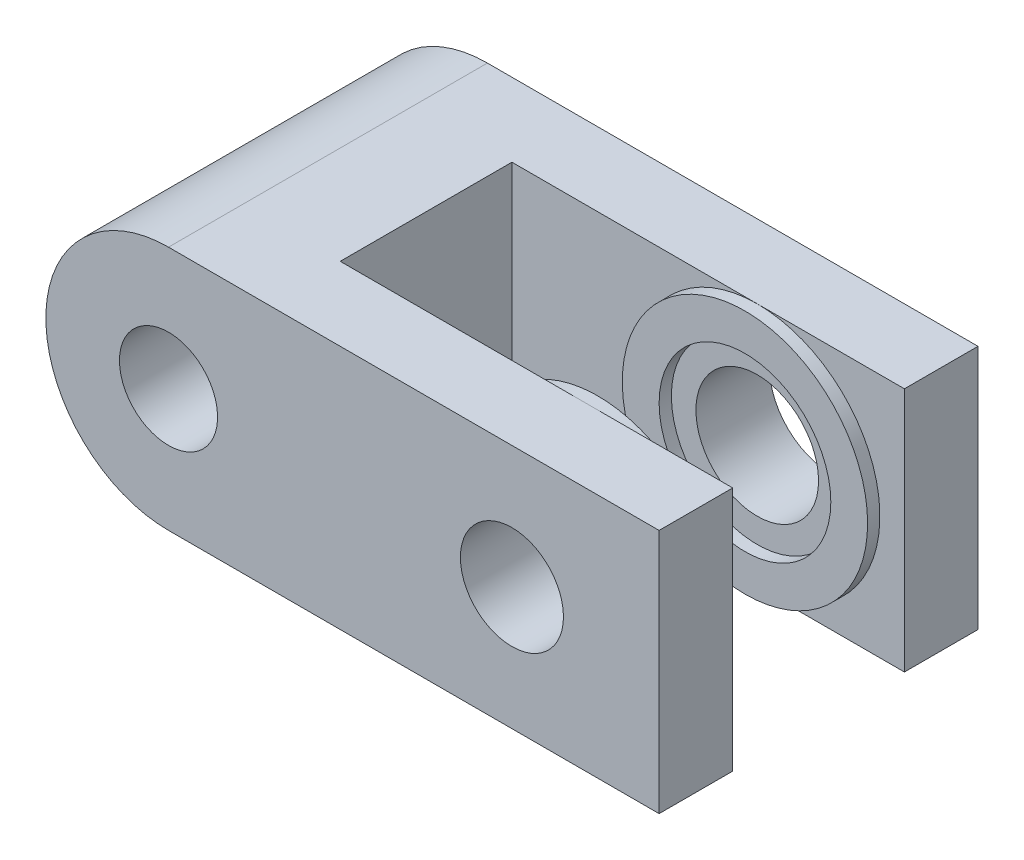
ISO-10303-21;
HEADER;
FILE_DESCRIPTION(('STEP AP214'),'2;1');
FILE_NAME('part.step','',(''),(''),'','','');
FILE_SCHEMA(('AUTOMOTIVE_DESIGN { 1 0 10303 214 1 1 1 1 }'));
ENDSEC;
DATA;
#1=APPLICATION_CONTEXT('core data for automotive mechanical design processes');
#2=APPLICATION_PROTOCOL_DEFINITION('international standard','automotive_design',2000,#1);
#3=PRODUCT_CONTEXT('',#1,'mechanical');
#4=PRODUCT('Part','Part','',(#3));
#5=PRODUCT_RELATED_PRODUCT_CATEGORY('part','',(#4));
#6=PRODUCT_DEFINITION_FORMATION('','',#4);
#7=PRODUCT_DEFINITION_CONTEXT('part definition',#1,'design');
#8=PRODUCT_DEFINITION('design','',#6,#7);
#9=PRODUCT_DEFINITION_SHAPE('','',#8);
#10=(LENGTH_UNIT() NAMED_UNIT(*) SI_UNIT(.MILLI.,.METRE.));
#11=(NAMED_UNIT(*) PLANE_ANGLE_UNIT() SI_UNIT($,.RADIAN.));
#12=(NAMED_UNIT(*) SI_UNIT($,.STERADIAN.) SOLID_ANGLE_UNIT());
#13=UNCERTAINTY_MEASURE_WITH_UNIT(LENGTH_MEASURE(1.E-05),#10,'distance_accuracy_value','');
#14=(GEOMETRIC_REPRESENTATION_CONTEXT(3) GLOBAL_UNCERTAINTY_ASSIGNED_CONTEXT((#13)) GLOBAL_UNIT_ASSIGNED_CONTEXT((#10,
#11,#12)) REPRESENTATION_CONTEXT('',''));
#15=CARTESIAN_POINT('',(0.,0.,0.));
#16=DIRECTION('',(0.,0.,1.));
#17=DIRECTION('',(1.,0.,0.));
#18=AXIS2_PLACEMENT_3D('',#15,#16,#17);
#19=CARTESIAN_POINT('',(20.,-5.,10.));
#20=DIRECTION('',(0.,0.,1.));
#21=DIRECTION('',(1.,0.,0.));
#22=AXIS2_PLACEMENT_3D('',#19,#20,#21);
#23=PLANE('',#22);
#24=CARTESIAN_POINT('',(14.,0.,10.));
#25=DIRECTION('',(0.,0.,-1.));
#26=DIRECTION('',(-1.,0.,0.));
#27=AXIS2_PLACEMENT_3D('',#24,#25,#26);
#28=CIRCLE('',#27,5.);
#29=CARTESIAN_POINT('',(14.,-5.,10.));
#30=VERTEX_POINT('',#29);
#31=CARTESIAN_POINT('',(14.,5.,10.));
#32=VERTEX_POINT('',#31);
#33=EDGE_CURVE('E137',#30,#32,#28,.T.);
#34=ORIENTED_EDGE('',*,*,#33,.F.);
#35=DIRECTION('',(1.,0.,0.));
#36=VECTOR('',#35,1.);
#37=CARTESIAN_POINT('',(20.,-5.,10.));
#38=LINE('',#37,#36);
#39=CARTESIAN_POINT('',(4.,-5.,10.));
#40=VERTEX_POINT('',#39);
#41=EDGE_CURVE('E120',#40,#30,#38,.T.);
#42=ORIENTED_EDGE('',*,*,#41,.F.);
#43=DIRECTION('',(0.,1.,0.));
#44=VECTOR('',#43,1.);
#45=CARTESIAN_POINT('',(4.,-5.,10.));
#46=LINE('',#45,#44);
#47=CARTESIAN_POINT('',(4.,5.,10.));
#48=VERTEX_POINT('',#47);
#49=EDGE_CURVE('E192',#40,#48,#46,.T.);
#50=ORIENTED_EDGE('',*,*,#49,.T.);
#51=DIRECTION('',(1.,0.,0.));
#52=VECTOR('',#51,1.);
#53=CARTESIAN_POINT('',(20.,5.,10.));
#54=LINE('',#53,#52);
#55=EDGE_CURVE('E139',#48,#32,#54,.T.);
#56=ORIENTED_EDGE('',*,*,#55,.T.);
#57=EDGE_LOOP('',(#34,#42,#50,#56));
#58=FACE_BOUND('',#57,.T.);
#59=ADVANCED_FACE('F41',(#58),#23,.F.);
#60=EDGE_CURVE('E56',#32,#30,#28,.T.);
#61=ORIENTED_EDGE('',*,*,#60,.F.);
#62=CARTESIAN_POINT('',(20.,5.,10.));
#63=VERTEX_POINT('',#62);
#64=EDGE_CURVE('E188',#32,#63,#54,.T.);
#65=ORIENTED_EDGE('',*,*,#64,.T.);
#66=DIRECTION('',(0.,1.,0.));
#67=VECTOR('',#66,1.);
#68=CARTESIAN_POINT('',(20.,-5.,10.));
#69=LINE('',#68,#67);
#70=CARTESIAN_POINT('',(20.,-5.,10.));
#71=VERTEX_POINT('',#70);
#72=EDGE_CURVE('E133',#71,#63,#69,.T.);
#73=ORIENTED_EDGE('',*,*,#72,.F.);
#74=EDGE_CURVE('E123',#30,#71,#38,.T.);
#75=ORIENTED_EDGE('',*,*,#74,.F.);
#76=EDGE_LOOP('',(#61,#65,#73,#75));
#77=FACE_BOUND('',#76,.T.);
#78=ADVANCED_FACE('F131',(#77),#23,.F.);
#79=CARTESIAN_POINT('',(20.,-5.,3.));
#80=DIRECTION('',(0.,0.,-1.));
#81=DIRECTION('',(-1.,0.,0.));
#82=AXIS2_PLACEMENT_3D('',#79,#80,#81);
#83=PLANE('',#82);
#84=CARTESIAN_POINT('',(14.,0.,3.));
#85=DIRECTION('',(0.,0.,-1.));
#86=DIRECTION('',(-1.,0.,0.));
#87=AXIS2_PLACEMENT_3D('',#84,#85,#86);
#88=CIRCLE('',#87,5.);
#89=CARTESIAN_POINT('',(14.,-5.,3.));
#90=VERTEX_POINT('',#89);
#91=CARTESIAN_POINT('',(14.,5.,3.));
#92=VERTEX_POINT('',#91);
#93=EDGE_CURVE('E11',#90,#92,#88,.F.);
#94=ORIENTED_EDGE('',*,*,#93,.F.);
#95=DIRECTION('',(-1.,0.,0.));
#96=VECTOR('',#95,1.);
#97=CARTESIAN_POINT('',(20.,-5.,3.));
#98=LINE('',#97,#96);
#99=CARTESIAN_POINT('',(20.,-5.,3.));
#100=VERTEX_POINT('',#99);
#101=EDGE_CURVE('E178',#100,#90,#98,.T.);
#102=ORIENTED_EDGE('',*,*,#101,.F.);
#103=DIRECTION('',(0.,1.,0.));
#104=VECTOR('',#103,1.);
#105=CARTESIAN_POINT('',(20.,-5.,3.));
#106=LINE('',#105,#104);
#107=CARTESIAN_POINT('',(20.,5.,3.00000000000001));
#108=VERTEX_POINT('',#107);
#109=EDGE_CURVE('E129',#100,#108,#106,.T.);
#110=ORIENTED_EDGE('',*,*,#109,.T.);
#111=DIRECTION('',(-1.,0.,0.));
#112=VECTOR('',#111,1.);
#113=CARTESIAN_POINT('',(20.,5.,3.));
#114=LINE('',#113,#112);
#115=EDGE_CURVE('E182',#108,#92,#114,.T.);
#116=ORIENTED_EDGE('',*,*,#115,.T.);
#117=EDGE_LOOP('',(#94,#102,#110,#116));
#118=FACE_BOUND('',#117,.T.);
#119=ADVANCED_FACE('F252',(#118),#83,.F.);
#120=CARTESIAN_POINT('',(14.,0.,3.));
#121=DIRECTION('',(0.,0.,1.));
#122=DIRECTION('',(1.,0.,0.));
#123=AXIS2_PLACEMENT_3D('',#120,#121,#122);
#124=CIRCLE('',#123,2.5);
#125=CARTESIAN_POINT('',(16.5,0.,3.));
#126=VERTEX_POINT('',#125);
#127=EDGE_CURVE('E169',#126,#126,#124,.T.);
#128=ORIENTED_EDGE('',*,*,#127,.F.);
#129=EDGE_LOOP('',(#128));
#130=FACE_BOUND('',#129,.T.);
#131=CARTESIAN_POINT('',(14.,0.,3.));
#132=DIRECTION('',(0.,0.,1.));
#133=DIRECTION('',(1.,0.,0.));
#134=AXIS2_PLACEMENT_3D('',#131,#132,#133);
#135=CIRCLE('',#134,3.5);
#136=CARTESIAN_POINT('',(17.5,0.,3.));
#137=VERTEX_POINT('',#136);
#138=EDGE_CURVE('E146',#137,#137,#135,.T.);
#139=ORIENTED_EDGE('',*,*,#138,.T.);
#140=EDGE_LOOP('',(#139));
#141=FACE_BOUND('',#140,.T.);
#142=ADVANCED_FACE('F287',(#130,#141),#83,.F.);
#143=CARTESIAN_POINT('',(0.,0.,13.));
#144=DIRECTION('',(0.,0.,-1.));
#145=DIRECTION('',(-1.,0.,0.));
#146=AXIS2_PLACEMENT_3D('',#143,#144,#145);
#147=CYLINDRICAL_SURFACE('',#146,2.);
#148=CARTESIAN_POINT('',(0.,0.,13.));
#149=DIRECTION('',(0.,0.,1.));
#150=DIRECTION('',(1.,0.,0.));
#151=AXIS2_PLACEMENT_3D('',#148,#149,#150);
#152=CIRCLE('',#151,2.);
#153=CARTESIAN_POINT('',(-2.,0.,13.));
#154=VERTEX_POINT('',#153);
#155=EDGE_CURVE('E210',#154,#154,#152,.T.);
#156=CARTESIAN_POINT('',(0.,0.,4.));
#157=DIRECTION('',(0.,0.,-1.));
#158=DIRECTION('',(-1.,0.,0.));
#159=AXIS2_PLACEMENT_3D('',#156,#157,#158);
#160=CIRCLE('',#159,2.);
#161=CARTESIAN_POINT('',(-2.,0.,4.));
#162=VERTEX_POINT('',#161);
#163=EDGE_CURVE('E162',#162,#162,#160,.T.);
#164=CARTESIAN_POINT('',(-2.,0.,13.));
#165=CARTESIAN_POINT('',(-2.,0.,12.90625));
#166=CARTESIAN_POINT('',(-2.,0.,12.8125));
#167=CARTESIAN_POINT('',(-2.,0.,12.625));
#168=CARTESIAN_POINT('',(-2.,0.,12.53125));
#169=CARTESIAN_POINT('',(-2.,0.,12.34375));
#170=CARTESIAN_POINT('',(-2.,0.,12.25));
#171=CARTESIAN_POINT('',(-2.,0.,12.0625));
#172=CARTESIAN_POINT('',(-2.,0.,11.96875));
#173=CARTESIAN_POINT('',(-2.,0.,11.78125));
#174=CARTESIAN_POINT('',(-2.,0.,11.6875));
#175=CARTESIAN_POINT('',(-2.,0.,11.5));
#176=CARTESIAN_POINT('',(-2.,0.,11.40625));
#177=CARTESIAN_POINT('',(-2.,0.,11.21875));
#178=CARTESIAN_POINT('',(-2.,0.,11.125));
#179=CARTESIAN_POINT('',(-2.,0.,10.9375));
#180=CARTESIAN_POINT('',(-2.,0.,10.84375));
#181=CARTESIAN_POINT('',(-2.,0.,10.65625));
#182=CARTESIAN_POINT('',(-2.,0.,10.5625));
#183=CARTESIAN_POINT('',(-2.,0.,10.375));
#184=CARTESIAN_POINT('',(-2.,0.,10.28125));
#185=CARTESIAN_POINT('',(-2.,0.,10.09375));
#186=CARTESIAN_POINT('',(-2.,0.,10.));
#187=CARTESIAN_POINT('',(-2.,0.,9.8125));
#188=CARTESIAN_POINT('',(-2.,0.,9.71875));
#189=CARTESIAN_POINT('',(-2.,0.,9.53125));
#190=CARTESIAN_POINT('',(-2.,0.,9.4375));
#191=CARTESIAN_POINT('',(-2.,0.,9.25));
#192=CARTESIAN_POINT('',(-2.,0.,9.15625));
#193=CARTESIAN_POINT('',(-2.,0.,8.96875));
#194=CARTESIAN_POINT('',(-2.,0.,8.875));
#195=CARTESIAN_POINT('',(-2.,0.,8.6875));
#196=CARTESIAN_POINT('',(-2.,0.,8.59375));
#197=CARTESIAN_POINT('',(-2.,0.,8.40625));
#198=CARTESIAN_POINT('',(-2.,0.,8.3125));
#199=CARTESIAN_POINT('',(-2.,0.,8.125));
#200=CARTESIAN_POINT('',(-2.,0.,8.03125));
#201=CARTESIAN_POINT('',(-2.,0.,7.84375));
#202=CARTESIAN_POINT('',(-2.,0.,7.75));
#203=CARTESIAN_POINT('',(-2.,0.,7.5625));
#204=CARTESIAN_POINT('',(-2.,0.,7.46875));
#205=CARTESIAN_POINT('',(-2.,0.,7.28125));
#206=CARTESIAN_POINT('',(-2.,0.,7.1875));
#207=CARTESIAN_POINT('',(-2.,0.,7.));
#208=CARTESIAN_POINT('',(-2.,0.,6.90625));
#209=CARTESIAN_POINT('',(-2.,0.,6.71875));
#210=CARTESIAN_POINT('',(-2.,0.,6.625));
#211=CARTESIAN_POINT('',(-2.,0.,6.4375));
#212=CARTESIAN_POINT('',(-2.,0.,6.34375));
#213=CARTESIAN_POINT('',(-2.,0.,6.15625));
#214=CARTESIAN_POINT('',(-2.,0.,6.0625));
#215=CARTESIAN_POINT('',(-2.,0.,5.875));
#216=CARTESIAN_POINT('',(-2.,0.,5.78125));
#217=CARTESIAN_POINT('',(-2.,0.,5.59375));
#218=CARTESIAN_POINT('',(-2.,0.,5.5));
#219=CARTESIAN_POINT('',(-2.,0.,5.3125));
#220=CARTESIAN_POINT('',(-2.,0.,5.21875));
#221=CARTESIAN_POINT('',(-2.,0.,5.03125));
#222=CARTESIAN_POINT('',(-2.,0.,4.9375));
#223=CARTESIAN_POINT('',(-2.,0.,4.75));
#224=CARTESIAN_POINT('',(-2.,0.,4.65625));
#225=CARTESIAN_POINT('',(-2.,0.,4.46875));
#226=CARTESIAN_POINT('',(-2.,0.,4.375));
#227=CARTESIAN_POINT('',(-2.,0.,4.1875));
#228=CARTESIAN_POINT('',(-2.,0.,4.09375));
#229=CARTESIAN_POINT('',(-2.,0.,4.));
#230=B_SPLINE_CURVE_WITH_KNOTS('',3,(#164,#165,#166,#167,#168,#169,#170,#171,#172,#173,#174,
#175,#176,#177,#178,#179,#180,#181,#182,#183,#184,#185,#186,#187,#188,#189,#190,#191,#192,#193,
#194,#195,#196,#197,#198,#199,#200,#201,#202,#203,#204,#205,#206,#207,#208,#209,#210,#211,#212,
#213,#214,#215,#216,#217,#218,#219,#220,#221,#222,#223,#224,#225,#226,#227,#228,#229),
.UNSPECIFIED.,.F.,.F.,(4,2,2,2,2,2,2,2,2,2,2,2,2,2,2,2,2,2,2,2,2,2,2,2,2,2,2,2,2,2,2,2,4),(0.,
0.28125,0.5625,0.843750000000001,1.125,1.40625,1.6875,1.96875,2.25,2.53125,2.8125,3.09375,3.375,
3.65625,3.9375,4.21875,4.5,4.78125,5.0625,5.34375,5.625,5.90625,6.1875,6.46875,6.75,7.03125,
7.3125,7.59375,7.875,8.15625,8.4375,8.71875,9.),.UNSPECIFIED.);
#231=EDGE_CURVE('BSEAM295',#154,#162,#230,.T.);
#232=ORIENTED_EDGE('',*,*,#155,.T.);
#233=ORIENTED_EDGE('',*,*,#163,.T.);
#234=ORIENTED_EDGE('',*,*,#231,.T.);
#235=ORIENTED_EDGE('',*,*,#231,.F.);
#236=EDGE_LOOP('',(#232,#234,#233,#235));
#237=FACE_BOUND('',#236,.T.);
#238=ADVANCED_FACE('F295',(#237),#147,.F.);
#239=CARTESIAN_POINT('',(20.,0.,13.));
#240=DIRECTION('',(1.,0.,0.));
#241=DIRECTION('',(0.,1.,0.));
#242=AXIS2_PLACEMENT_3D('',#239,#240,#241);
#243=PLANE('',#242);
#244=ORIENTED_EDGE('',*,*,#72,.T.);
#245=DIRECTION('',(0.,0.,-1.));
#246=VECTOR('',#245,1.);
#247=CARTESIAN_POINT('',(20.,5.,13.));
#248=LINE('',#247,#246);
#249=CARTESIAN_POINT('',(20.,5.,13.));
#250=VERTEX_POINT('',#249);
#251=EDGE_CURVE('E226',#250,#63,#248,.T.);
#252=ORIENTED_EDGE('',*,*,#251,.F.);
#253=DIRECTION('',(0.,-1.,0.));
#254=VECTOR('',#253,1.);
#255=CARTESIAN_POINT('',(20.,0.,13.));
#256=LINE('',#255,#254);
#257=CARTESIAN_POINT('',(20.,-5.,13.));
#258=VERTEX_POINT('',#257);
#259=EDGE_CURVE('E204',#250,#258,#256,.T.);
#260=ORIENTED_EDGE('',*,*,#259,.T.);
#261=DIRECTION('',(0.,0.,-1.));
#262=VECTOR('',#261,1.);
#263=CARTESIAN_POINT('',(20.,-5.,13.));
#264=LINE('',#263,#262);
#265=EDGE_CURVE('E230',#258,#71,#264,.T.);
#266=ORIENTED_EDGE('',*,*,#265,.T.);
#267=EDGE_LOOP('',(#244,#252,#260,#266));
#268=FACE_BOUND('',#267,.T.);
#269=ADVANCED_FACE('F298',(#268),#243,.T.);
#270=CARTESIAN_POINT('',(0.,0.,13.));
#271=DIRECTION('',(0.,0.,-1.));
#272=DIRECTION('',(-1.,0.,0.));
#273=AXIS2_PLACEMENT_3D('',#270,#271,#272);
#274=CYLINDRICAL_SURFACE('',#273,5.);
#275=CARTESIAN_POINT('',(0.,0.,0.));
#276=DIRECTION('',(0.,0.,1.));
#277=DIRECTION('',(1.,0.,0.));
#278=AXIS2_PLACEMENT_3D('',#275,#276,#277);
#279=CIRCLE('',#278,5.);
#280=CARTESIAN_POINT('',(0.,5.,0.));
#281=VERTEX_POINT('',#280);
#282=CARTESIAN_POINT('',(0.,-5.,0.));
#283=VERTEX_POINT('',#282);
#284=EDGE_CURVE('E191',#281,#283,#279,.T.);
#285=ORIENTED_EDGE('',*,*,#284,.T.);
#286=DIRECTION('',(0.,0.,-1.));
#287=VECTOR('',#286,1.);
#288=CARTESIAN_POINT('',(0.,-5.,13.));
#289=LINE('',#288,#287);
#290=CARTESIAN_POINT('',(0.,-5.,13.));
#291=VERTEX_POINT('',#290);
#292=EDGE_CURVE('E49',#291,#283,#289,.T.);
#293=ORIENTED_EDGE('',*,*,#292,.F.);
#294=CARTESIAN_POINT('',(0.,0.,13.));
#295=DIRECTION('',(0.,0.,1.));
#296=DIRECTION('',(1.,0.,0.));
#297=AXIS2_PLACEMENT_3D('',#294,#295,#296);
#298=CIRCLE('',#297,5.);
#299=CARTESIAN_POINT('',(0.,5.,13.));
#300=VERTEX_POINT('',#299);
#301=EDGE_CURVE('E198',#300,#291,#298,.T.);
#302=ORIENTED_EDGE('',*,*,#301,.F.);
#303=DIRECTION('',(0.,0.,-1.));
#304=VECTOR('',#303,1.);
#305=CARTESIAN_POINT('',(0.,5.,13.));
#306=LINE('',#305,#304);
#307=EDGE_CURVE('E213',#300,#281,#306,.T.);
#308=ORIENTED_EDGE('',*,*,#307,.T.);
#309=EDGE_LOOP('',(#285,#293,#302,#308));
#310=FACE_BOUND('',#309,.T.);
#311=ADVANCED_FACE('F43',(#310),#274,.T.);
#312=CARTESIAN_POINT('',(0.,-5.,13.));
#313=DIRECTION('',(0.,1.,0.));
#314=DIRECTION('',(0.,0.,1.));
#315=AXIS2_PLACEMENT_3D('',#312,#313,#314);
#316=PLANE('',#315);
#317=DIRECTION('',(0.,0.,1.));
#318=VECTOR('',#317,1.);
#319=CARTESIAN_POINT('',(4.,-5.,3.));
#320=LINE('',#319,#318);
#321=CARTESIAN_POINT('',(4.,-5.,3.));
#322=VERTEX_POINT('',#321);
#323=EDGE_CURVE('E126',#322,#40,#320,.T.);
#324=ORIENTED_EDGE('',*,*,#323,.T.);
#325=ORIENTED_EDGE('',*,*,#41,.T.);
#326=ORIENTED_EDGE('',*,*,#74,.T.);
#327=ORIENTED_EDGE('',*,*,#265,.F.);
#328=DIRECTION('',(1.,0.,0.));
#329=VECTOR('',#328,1.);
#330=CARTESIAN_POINT('',(0.,-5.,13.));
#331=LINE('',#330,#329);
#332=EDGE_CURVE('E201',#291,#258,#331,.T.);
#333=ORIENTED_EDGE('',*,*,#332,.F.);
#334=ORIENTED_EDGE('',*,*,#292,.T.);
#335=DIRECTION('',(1.,0.,0.));
#336=VECTOR('',#335,1.);
#337=CARTESIAN_POINT('',(0.,-5.,0.));
#338=LINE('',#337,#336);
#339=CARTESIAN_POINT('',(20.,-5.,0.));
#340=VERTEX_POINT('',#339);
#341=EDGE_CURVE('E216',#283,#340,#338,.T.);
#342=ORIENTED_EDGE('',*,*,#341,.T.);
#343=EDGE_CURVE('E229',#100,#340,#264,.T.);
#344=ORIENTED_EDGE('',*,*,#343,.F.);
#345=ORIENTED_EDGE('',*,*,#101,.T.);
#346=EDGE_CURVE('E180',#90,#322,#98,.T.);
#347=ORIENTED_EDGE('',*,*,#346,.T.);
#348=EDGE_LOOP('',(#324,#325,#326,#327,#333,#334,#342,#344,#345,#347));
#349=FACE_BOUND('',#348,.T.);
#350=ADVANCED_FACE('F121',(#349),#316,.F.);
#351=ORIENTED_EDGE('',*,*,#109,.F.);
#352=ORIENTED_EDGE('',*,*,#343,.T.);
#353=DIRECTION('',(0.,-1.,0.));
#354=VECTOR('',#353,1.);
#355=CARTESIAN_POINT('',(20.,0.,0.));
#356=LINE('',#355,#354);
#357=CARTESIAN_POINT('',(20.,5.,0.));
#358=VERTEX_POINT('',#357);
#359=EDGE_CURVE('E219',#358,#340,#356,.T.);
#360=ORIENTED_EDGE('',*,*,#359,.F.);
#361=EDGE_CURVE('E225',#108,#358,#248,.T.);
#362=ORIENTED_EDGE('',*,*,#361,.F.);
#363=EDGE_LOOP('',(#351,#352,#360,#362));
#364=FACE_BOUND('',#363,.T.);
#365=ADVANCED_FACE('F247',(#364),#243,.T.);
#366=CARTESIAN_POINT('',(0.,5.,13.));
#367=DIRECTION('',(0.,1.,0.));
#368=DIRECTION('',(0.,0.,1.));
#369=AXIS2_PLACEMENT_3D('',#366,#367,#368);
#370=PLANE('',#369);
#371=ORIENTED_EDGE('',*,*,#55,.F.);
#372=DIRECTION('',(0.,0.,1.));
#373=VECTOR('',#372,1.);
#374=CARTESIAN_POINT('',(4.,5.,3.));
#375=LINE('',#374,#373);
#376=CARTESIAN_POINT('',(4.,5.,3.));
#377=VERTEX_POINT('',#376);
#378=EDGE_CURVE('E185',#377,#48,#375,.T.);
#379=ORIENTED_EDGE('',*,*,#378,.F.);
#380=EDGE_CURVE('E177',#92,#377,#114,.T.);
#381=ORIENTED_EDGE('',*,*,#380,.F.);
#382=ORIENTED_EDGE('',*,*,#115,.F.);
#383=ORIENTED_EDGE('',*,*,#361,.T.);
#384=DIRECTION('',(1.,0.,0.));
#385=VECTOR('',#384,1.);
#386=CARTESIAN_POINT('',(0.,5.,0.));
#387=LINE('',#386,#385);
#388=EDGE_CURVE('E202',#281,#358,#387,.T.);
#389=ORIENTED_EDGE('',*,*,#388,.F.);
#390=ORIENTED_EDGE('',*,*,#307,.F.);
#391=DIRECTION('',(1.,0.,0.));
#392=VECTOR('',#391,1.);
#393=CARTESIAN_POINT('',(0.,5.,13.));
#394=LINE('',#393,#392);
#395=EDGE_CURVE('E207',#300,#250,#394,.T.);
#396=ORIENTED_EDGE('',*,*,#395,.T.);
#397=ORIENTED_EDGE('',*,*,#251,.T.);
#398=ORIENTED_EDGE('',*,*,#64,.F.);
#399=EDGE_LOOP('',(#371,#379,#381,#382,#383,#389,#390,#396,#397,#398));
#400=FACE_BOUND('',#399,.T.);
#401=ADVANCED_FACE('F241',(#400),#370,.T.);
#402=CARTESIAN_POINT('',(0.,0.,13.));
#403=DIRECTION('',(0.,0.,1.));
#404=DIRECTION('',(1.,0.,0.));
#405=AXIS2_PLACEMENT_3D('',#402,#403,#404);
#406=PLANE('',#405);
#407=CARTESIAN_POINT('',(14.,0.,13.));
#408=DIRECTION('',(0.,0.,1.));
#409=DIRECTION('',(1.,0.,0.));
#410=AXIS2_PLACEMENT_3D('',#407,#408,#409);
#411=CIRCLE('',#410,2.1);
#412=CARTESIAN_POINT('',(16.1,0.,13.));
#413=VERTEX_POINT('',#412);
#414=EDGE_CURVE('E158',#413,#413,#411,.T.);
#415=ORIENTED_EDGE('',*,*,#414,.F.);
#416=EDGE_LOOP('',(#415));
#417=FACE_BOUND('',#416,.T.);
#418=ORIENTED_EDGE('',*,*,#301,.T.);
#419=ORIENTED_EDGE('',*,*,#332,.T.);
#420=ORIENTED_EDGE('',*,*,#259,.F.);
#421=ORIENTED_EDGE('',*,*,#395,.F.);
#422=EDGE_LOOP('',(#418,#419,#420,#421));
#423=FACE_BOUND('',#422,.T.);
#424=ORIENTED_EDGE('',*,*,#155,.F.);
#425=EDGE_LOOP('',(#424));
#426=FACE_BOUND('',#425,.T.);
#427=ADVANCED_FACE('F288',(#417,#423,#426),#406,.T.);
#428=CARTESIAN_POINT('',(0.,0.,0.));
#429=DIRECTION('',(0.,0.,1.));
#430=DIRECTION('',(1.,0.,0.));
#431=AXIS2_PLACEMENT_3D('',#428,#429,#430);
#432=PLANE('',#431);
#433=CARTESIAN_POINT('',(0.,0.,0.));
#434=DIRECTION('',(0.,0.,-1.));
#435=DIRECTION('',(-1.,0.,0.));
#436=AXIS2_PLACEMENT_3D('',#433,#434,#435);
#437=CIRCLE('',#436,3.5);
#438=CARTESIAN_POINT('',(-3.5,0.,0.));
#439=VERTEX_POINT('',#438);
#440=EDGE_CURVE('E165',#439,#439,#437,.T.);
#441=ORIENTED_EDGE('',*,*,#440,.F.);
#442=EDGE_LOOP('',(#441));
#443=FACE_BOUND('',#442,.T.);
#444=CARTESIAN_POINT('',(14.,0.,0.));
#445=DIRECTION('',(0.,0.,1.));
#446=DIRECTION('',(1.,0.,0.));
#447=AXIS2_PLACEMENT_3D('',#444,#445,#446);
#448=CIRCLE('',#447,2.5);
#449=CARTESIAN_POINT('',(16.5,0.,0.));
#450=VERTEX_POINT('',#449);
#451=EDGE_CURVE('E174',#450,#450,#448,.F.);
#452=ORIENTED_EDGE('',*,*,#451,.F.);
#453=EDGE_LOOP('',(#452));
#454=FACE_BOUND('',#453,.T.);
#455=ORIENTED_EDGE('',*,*,#284,.F.);
#456=ORIENTED_EDGE('',*,*,#388,.T.);
#457=ORIENTED_EDGE('',*,*,#359,.T.);
#458=ORIENTED_EDGE('',*,*,#341,.F.);
#459=EDGE_LOOP('',(#455,#456,#457,#458));
#460=FACE_BOUND('',#459,.T.);
#461=ADVANCED_FACE('F239',(#443,#454,#460),#432,.F.);
#462=CARTESIAN_POINT('',(4.,-5.,3.));
#463=DIRECTION('',(-1.,0.,0.));
#464=DIRECTION('',(0.,0.,1.));
#465=AXIS2_PLACEMENT_3D('',#462,#463,#464);
#466=PLANE('',#465);
#467=ORIENTED_EDGE('',*,*,#378,.T.);
#468=ORIENTED_EDGE('',*,*,#49,.F.);
#469=ORIENTED_EDGE('',*,*,#323,.F.);
#470=DIRECTION('',(0.,1.,0.));
#471=VECTOR('',#470,1.);
#472=CARTESIAN_POINT('',(4.,-5.,3.));
#473=LINE('',#472,#471);
#474=EDGE_CURVE('E194',#322,#377,#473,.T.);
#475=ORIENTED_EDGE('',*,*,#474,.T.);
#476=EDGE_LOOP('',(#467,#468,#469,#475));
#477=FACE_BOUND('',#476,.T.);
#478=ADVANCED_FACE('F281',(#477),#466,.F.);
#479=CARTESIAN_POINT('',(14.,0.,3.));
#480=DIRECTION('',(0.,0.,1.));
#481=DIRECTION('',(1.,0.,0.));
#482=AXIS2_PLACEMENT_3D('',#479,#480,#481);
#483=CIRCLE('',#482,5.);
#484=EDGE_CURVE('E64',#92,#90,#483,.T.);
#485=ORIENTED_EDGE('',*,*,#484,.F.);
#486=ORIENTED_EDGE('',*,*,#380,.T.);
#487=ORIENTED_EDGE('',*,*,#474,.F.);
#488=ORIENTED_EDGE('',*,*,#346,.F.);
#489=EDGE_LOOP('',(#485,#486,#487,#488));
#490=FACE_BOUND('',#489,.T.);
#491=ADVANCED_FACE('F251',(#490),#83,.F.);
#492=CARTESIAN_POINT('',(14.,0.,-7.07106781186549));
#493=DIRECTION('',(0.,0.,1.));
#494=DIRECTION('',(1.,0.,0.));
#495=AXIS2_PLACEMENT_3D('',#492,#493,#494);
#496=CYLINDRICAL_SURFACE('',#495,2.5);
#497=ORIENTED_EDGE('',*,*,#451,.T.);
#498=EDGE_LOOP('',(#497));
#499=FACE_BOUND('',#498,.T.);
#500=ORIENTED_EDGE('',*,*,#127,.T.);
#501=EDGE_LOOP('',(#500));
#502=FACE_BOUND('',#501,.T.);
#503=ADVANCED_FACE('F279',(#499,#502),#496,.F.);
#504=CARTESIAN_POINT('',(0.,0.,4.));
#505=DIRECTION('',(0.,0.,-1.));
#506=DIRECTION('',(-1.,0.,0.));
#507=AXIS2_PLACEMENT_3D('',#504,#505,#506);
#508=CYLINDRICAL_SURFACE('',#507,3.5);
#509=CARTESIAN_POINT('',(0.,0.,4.));
#510=DIRECTION('',(0.,0.,-1.));
#511=DIRECTION('',(-1.,0.,0.));
#512=AXIS2_PLACEMENT_3D('',#509,#510,#511);
#513=CIRCLE('',#512,3.5);
#514=CARTESIAN_POINT('',(-3.5,0.,4.));
#515=VERTEX_POINT('',#514);
#516=EDGE_CURVE('E166',#515,#515,#513,.T.);
#517=ORIENTED_EDGE('',*,*,#516,.F.);
#518=EDGE_LOOP('',(#517));
#519=FACE_BOUND('',#518,.T.);
#520=ORIENTED_EDGE('',*,*,#440,.T.);
#521=EDGE_LOOP('',(#520));
#522=FACE_BOUND('',#521,.T.);
#523=ADVANCED_FACE('F324',(#519,#522),#508,.F.);
#524=CARTESIAN_POINT('',(0.,0.,4.));
#525=DIRECTION('',(0.,0.,-1.));
#526=DIRECTION('',(-1.,0.,0.));
#527=AXIS2_PLACEMENT_3D('',#524,#525,#526);
#528=PLANE('',#527);
#529=ORIENTED_EDGE('',*,*,#163,.F.);
#530=EDGE_LOOP('',(#529));
#531=FACE_BOUND('',#530,.T.);
#532=ORIENTED_EDGE('',*,*,#516,.T.);
#533=EDGE_LOOP('',(#532));
#534=FACE_BOUND('',#533,.T.);
#535=ADVANCED_FACE('F321',(#531,#534),#528,.T.);
#536=CARTESIAN_POINT('',(14.,0.,14.));
#537=DIRECTION('',(0.,0.,-1.));
#538=DIRECTION('',(-1.,0.,0.));
#539=AXIS2_PLACEMENT_3D('',#536,#537,#538);
#540=CYLINDRICAL_SURFACE('',#539,2.1);
#541=ORIENTED_EDGE('',*,*,#414,.T.);
#542=EDGE_LOOP('',(#541));
#543=FACE_BOUND('',#542,.T.);
#544=CARTESIAN_POINT('',(14.,0.,9.5));
#545=DIRECTION('',(0.,0.,-1.));
#546=DIRECTION('',(-1.,0.,0.));
#547=AXIS2_PLACEMENT_3D('',#544,#545,#546);
#548=CIRCLE('',#547,2.1);
#549=CARTESIAN_POINT('',(11.9,0.,9.5));
#550=VERTEX_POINT('',#549);
#551=EDGE_CURVE('E141',#550,#550,#548,.T.);
#552=ORIENTED_EDGE('',*,*,#551,.T.);
#553=EDGE_LOOP('',(#552));
#554=FACE_BOUND('',#553,.T.);
#555=ADVANCED_FACE('F267',(#543,#554),#540,.F.);
#556=CARTESIAN_POINT('',(14.,0.,3.5));
#557=DIRECTION('',(0.,0.,1.));
#558=DIRECTION('',(1.,0.,0.));
#559=AXIS2_PLACEMENT_3D('',#556,#557,#558);
#560=PLANE('',#559);
#561=CARTESIAN_POINT('',(14.,0.,3.5));
#562=DIRECTION('',(0.,0.,1.));
#563=DIRECTION('',(1.,0.,0.));
#564=AXIS2_PLACEMENT_3D('',#561,#562,#563);
#565=CIRCLE('',#564,5.);
#566=CARTESIAN_POINT('',(19.,0.,3.5));
#567=VERTEX_POINT('',#566);
#568=EDGE_CURVE('E155',#567,#567,#565,.T.);
#569=ORIENTED_EDGE('',*,*,#568,.T.);
#570=EDGE_LOOP('',(#569));
#571=FACE_BOUND('',#570,.T.);
#572=CARTESIAN_POINT('',(14.,0.,3.5));
#573=DIRECTION('',(0.,0.,1.));
#574=DIRECTION('',(1.,0.,0.));
#575=AXIS2_PLACEMENT_3D('',#572,#573,#574);
#576=CIRCLE('',#575,3.5);
#577=CARTESIAN_POINT('',(17.5,0.,3.5));
#578=VERTEX_POINT('',#577);
#579=EDGE_CURVE('E150',#578,#578,#576,.T.);
#580=ORIENTED_EDGE('',*,*,#579,.F.);
#581=EDGE_LOOP('',(#580));
#582=FACE_BOUND('',#581,.T.);
#583=ADVANCED_FACE('F257',(#571,#582),#560,.T.);
#584=CARTESIAN_POINT('',(14.,0.,3.5));
#585=DIRECTION('',(0.,0.,-1.));
#586=DIRECTION('',(-1.,0.,0.));
#587=AXIS2_PLACEMENT_3D('',#584,#585,#586);
#588=CYLINDRICAL_SURFACE('',#587,5.);
#589=ORIENTED_EDGE('',*,*,#568,.F.);
#590=EDGE_LOOP('',(#589));
#591=FACE_BOUND('',#590,.T.);
#592=ORIENTED_EDGE('',*,*,#484,.T.);
#593=ORIENTED_EDGE('',*,*,#93,.T.);
#594=EDGE_LOOP('',(#592,#593));
#595=FACE_BOUND('',#594,.T.);
#596=ADVANCED_FACE('F254',(#591,#595),#588,.T.);
#597=CARTESIAN_POINT('',(14.,0.,3.5));
#598=DIRECTION('',(0.,0.,-1.));
#599=DIRECTION('',(-1.,0.,0.));
#600=AXIS2_PLACEMENT_3D('',#597,#598,#599);
#601=CYLINDRICAL_SURFACE('',#600,3.5);
#602=ORIENTED_EDGE('',*,*,#579,.T.);
#603=EDGE_LOOP('',(#602));
#604=FACE_BOUND('',#603,.T.);
#605=ORIENTED_EDGE('',*,*,#138,.F.);
#606=EDGE_LOOP('',(#605));
#607=FACE_BOUND('',#606,.T.);
#608=ADVANCED_FACE('F256',(#604,#607),#601,.F.);
#609=CARTESIAN_POINT('',(14.,0.,9.5));
#610=DIRECTION('',(0.,0.,-1.));
#611=DIRECTION('',(-1.,0.,0.));
#612=AXIS2_PLACEMENT_3D('',#609,#610,#611);
#613=PLANE('',#612);
#614=CARTESIAN_POINT('',(14.,0.,9.5));
#615=DIRECTION('',(0.,0.,-1.));
#616=DIRECTION('',(-1.,0.,0.));
#617=AXIS2_PLACEMENT_3D('',#614,#615,#616);
#618=CIRCLE('',#617,5.);
#619=CARTESIAN_POINT('',(9.00000000000001,0.,9.5));
#620=VERTEX_POINT('',#619);
#621=EDGE_CURVE('E144',#620,#620,#618,.T.);
#622=ORIENTED_EDGE('',*,*,#621,.T.);
#623=EDGE_LOOP('',(#622));
#624=FACE_BOUND('',#623,.T.);
#625=ORIENTED_EDGE('',*,*,#551,.F.);
#626=EDGE_LOOP('',(#625));
#627=FACE_BOUND('',#626,.T.);
#628=ADVANCED_FACE('F264',(#624,#627),#613,.T.);
#629=CARTESIAN_POINT('',(14.,0.,9.5));
#630=DIRECTION('',(0.,0.,1.));
#631=DIRECTION('',(1.,0.,0.));
#632=AXIS2_PLACEMENT_3D('',#629,#630,#631);
#633=CYLINDRICAL_SURFACE('',#632,5.);
#634=ORIENTED_EDGE('',*,*,#621,.F.);
#635=EDGE_LOOP('',(#634));
#636=FACE_BOUND('',#635,.T.);
#637=ORIENTED_EDGE('',*,*,#60,.T.);
#638=ORIENTED_EDGE('',*,*,#33,.T.);
#639=EDGE_LOOP('',(#637,#638));
#640=FACE_BOUND('',#639,.T.);
#641=ADVANCED_FACE('F143',(#636,#640),#633,.T.);
#642=CLOSED_SHELL('',(#59,#78,#119,#142,#238,#269,#311,#350,#365,#401,#427,#461,#478,#491,#503,
#523,#535,#555,#583,#596,#608,#628,#641));
#643=MANIFOLD_SOLID_BREP('B2',#642);
#644=ADVANCED_BREP_SHAPE_REPRESENTATION('',(#18,#643),#14);
#645=SHAPE_DEFINITION_REPRESENTATION(#9,#644);
ENDSEC;
END-ISO-10303-21;
